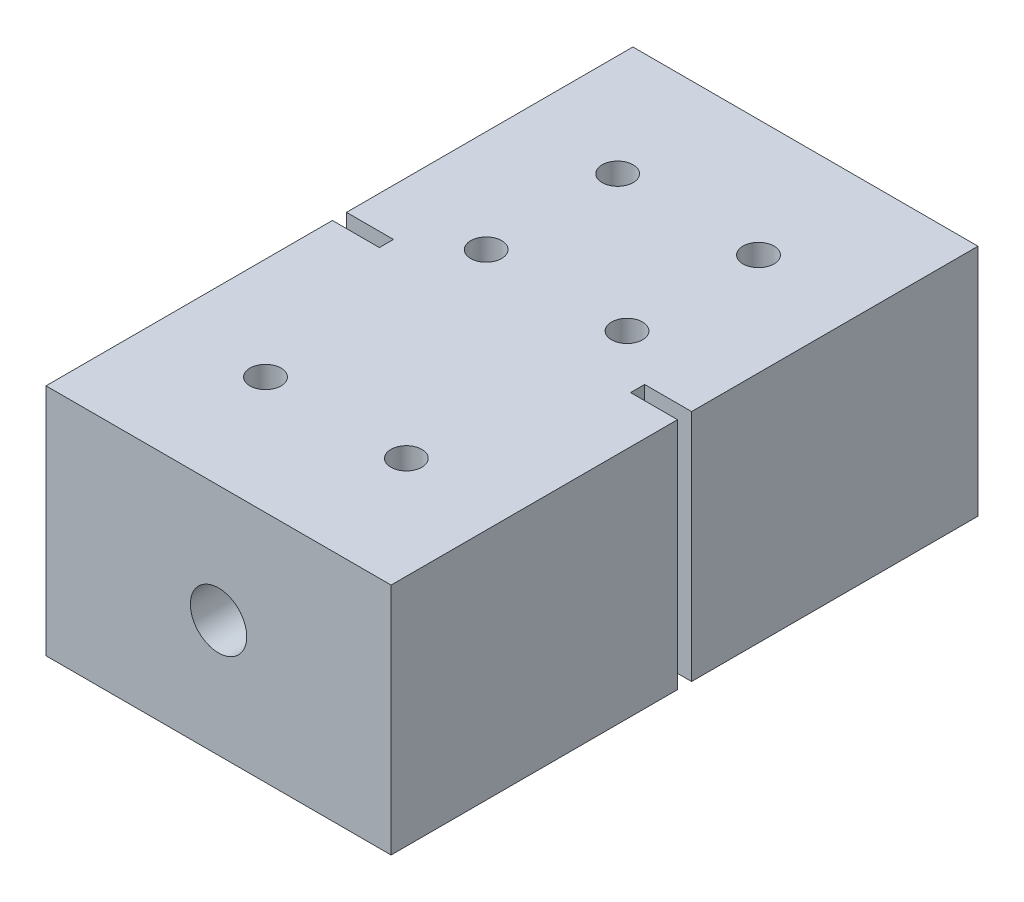
ISO-10303-21;
HEADER;
FILE_DESCRIPTION(('STEP AP214'),'2;1');
FILE_NAME('part.step','',(''),(''),'','','');
FILE_SCHEMA(('AUTOMOTIVE_DESIGN { 1 0 10303 214 1 1 1 1 }'));
ENDSEC;
DATA;
#1=APPLICATION_CONTEXT('core data for automotive mechanical design processes');
#2=APPLICATION_PROTOCOL_DEFINITION('international standard','automotive_design',2000,#1);
#3=PRODUCT_CONTEXT('',#1,'mechanical');
#4=PRODUCT('Part','Part','',(#3));
#5=PRODUCT_RELATED_PRODUCT_CATEGORY('part','',(#4));
#6=PRODUCT_DEFINITION_FORMATION('','',#4);
#7=PRODUCT_DEFINITION_CONTEXT('part definition',#1,'design');
#8=PRODUCT_DEFINITION('design','',#6,#7);
#9=PRODUCT_DEFINITION_SHAPE('','',#8);
#10=(LENGTH_UNIT() NAMED_UNIT(*) SI_UNIT(.MILLI.,.METRE.));
#11=(NAMED_UNIT(*) PLANE_ANGLE_UNIT() SI_UNIT($,.RADIAN.));
#12=(NAMED_UNIT(*) SI_UNIT($,.STERADIAN.) SOLID_ANGLE_UNIT());
#13=UNCERTAINTY_MEASURE_WITH_UNIT(LENGTH_MEASURE(1.E-05),#10,'distance_accuracy_value','');
#14=(GEOMETRIC_REPRESENTATION_CONTEXT(3) GLOBAL_UNCERTAINTY_ASSIGNED_CONTEXT((#13)) GLOBAL_UNIT_ASSIGNED_CONTEXT((#10,
#11,#12)) REPRESENTATION_CONTEXT('',''));
#15=CARTESIAN_POINT('',(0.,0.,0.));
#16=DIRECTION('',(0.,0.,1.));
#17=DIRECTION('',(1.,0.,0.));
#18=AXIS2_PLACEMENT_3D('',#15,#16,#17);
#19=CARTESIAN_POINT('',(0.,0.,125.));
#20=DIRECTION('',(1.,0.,0.));
#21=DIRECTION('',(0.,0.,-1.));
#22=AXIS2_PLACEMENT_3D('',#19,#20,#21);
#23=PLANE('',#22);
#24=DIRECTION('',(0.,-1.,0.));
#25=VECTOR('',#24,1.);
#26=CARTESIAN_POINT('',(0.,49.8,64.));
#27=LINE('',#26,#25);
#28=CARTESIAN_POINT('',(0.,49.8,64.));
#29=VERTEX_POINT('',#28);
#30=CARTESIAN_POINT('',(0.,0.,64.));
#31=VERTEX_POINT('',#30);
#32=EDGE_CURVE('E258',#29,#31,#27,.T.);
#33=ORIENTED_EDGE('',*,*,#32,.T.);
#34=DIRECTION('',(0.,0.,-1.));
#35=VECTOR('',#34,1.);
#36=CARTESIAN_POINT('',(0.,0.,125.));
#37=LINE('',#36,#35);
#38=CARTESIAN_POINT('',(0.,0.,125.));
#39=VERTEX_POINT('',#38);
#40=EDGE_CURVE('E11',#39,#31,#37,.T.);
#41=ORIENTED_EDGE('',*,*,#40,.F.);
#42=DIRECTION('',(0.,-1.,0.));
#43=VECTOR('',#42,1.);
#44=CARTESIAN_POINT('',(0.,0.,125.));
#45=LINE('',#44,#43);
#46=CARTESIAN_POINT('',(0.,49.8,125.));
#47=VERTEX_POINT('',#46);
#48=EDGE_CURVE('E181',#47,#39,#45,.T.);
#49=ORIENTED_EDGE('',*,*,#48,.F.);
#50=DIRECTION('',(0.,0.,-1.));
#51=VECTOR('',#50,1.);
#52=CARTESIAN_POINT('',(0.,49.8,125.));
#53=LINE('',#52,#51);
#54=EDGE_CURVE('E142',#47,#29,#53,.T.);
#55=ORIENTED_EDGE('',*,*,#54,.T.);
#56=EDGE_LOOP('',(#33,#41,#49,#55));
#57=FACE_BOUND('',#56,.T.);
#58=ADVANCED_FACE('F32',(#57),#23,.F.);
#59=DIRECTION('',(0.,-1.,0.));
#60=VECTOR('',#59,1.);
#61=CARTESIAN_POINT('',(0.,49.8,61.));
#62=LINE('',#61,#60);
#63=CARTESIAN_POINT('',(0.,49.8,61.));
#64=VERTEX_POINT('',#63);
#65=CARTESIAN_POINT('',(0.,0.,61.));
#66=VERTEX_POINT('',#65);
#67=EDGE_CURVE('E121',#64,#66,#62,.T.);
#68=ORIENTED_EDGE('',*,*,#67,.F.);
#69=CARTESIAN_POINT('',(0.,49.8,0.));
#70=VERTEX_POINT('',#69);
#71=EDGE_CURVE('E133',#64,#70,#53,.T.);
#72=ORIENTED_EDGE('',*,*,#71,.T.);
#73=DIRECTION('',(0.,-1.,0.));
#74=VECTOR('',#73,1.);
#75=CARTESIAN_POINT('',(0.,0.,0.));
#76=LINE('',#75,#74);
#77=CARTESIAN_POINT('',(0.,0.,0.));
#78=VERTEX_POINT('',#77);
#79=EDGE_CURVE('E178',#70,#78,#76,.T.);
#80=ORIENTED_EDGE('',*,*,#79,.T.);
#81=EDGE_CURVE('E39',#66,#78,#37,.T.);
#82=ORIENTED_EDGE('',*,*,#81,.F.);
#83=EDGE_LOOP('',(#68,#72,#80,#82));
#84=FACE_BOUND('',#83,.T.);
#85=ADVANCED_FACE('F131',(#84),#23,.F.);
#86=CARTESIAN_POINT('',(0.,0.,125.));
#87=DIRECTION('',(0.,1.,0.));
#88=DIRECTION('',(0.,0.,1.));
#89=AXIS2_PLACEMENT_3D('',#86,#87,#88);
#90=PLANE('',#89);
#91=CARTESIAN_POINT('',(51.75,0.,53.));
#92=DIRECTION('',(0.,1.,0.));
#93=DIRECTION('',(0.,0.,1.));
#94=AXIS2_PLACEMENT_3D('',#91,#92,#93);
#95=CIRCLE('',#94,3.29999999999999);
#96=CARTESIAN_POINT('',(51.75,0.,56.3));
#97=VERTEX_POINT('',#96);
#98=EDGE_CURVE('E218',#97,#97,#95,.T.);
#99=ORIENTED_EDGE('',*,*,#98,.T.);
#100=EDGE_LOOP('',(#99));
#101=FACE_BOUND('',#100,.T.);
#102=CARTESIAN_POINT('',(21.75,0.,53.));
#103=DIRECTION('',(0.,1.,0.));
#104=DIRECTION('',(0.,0.,1.));
#105=AXIS2_PLACEMENT_3D('',#102,#103,#104);
#106=CIRCLE('',#105,3.29999999999999);
#107=CARTESIAN_POINT('',(21.75,0.,56.3));
#108=VERTEX_POINT('',#107);
#109=EDGE_CURVE('E229',#108,#108,#106,.T.);
#110=ORIENTED_EDGE('',*,*,#109,.T.);
#111=EDGE_LOOP('',(#110));
#112=FACE_BOUND('',#111,.T.);
#113=CARTESIAN_POINT('',(21.75,0.,100.));
#114=DIRECTION('',(0.,1.,0.));
#115=DIRECTION('',(0.,0.,1.));
#116=AXIS2_PLACEMENT_3D('',#113,#114,#115);
#117=CIRCLE('',#116,3.29999999999999);
#118=CARTESIAN_POINT('',(21.75,0.,103.3));
#119=VERTEX_POINT('',#118);
#120=EDGE_CURVE('E235',#119,#119,#117,.T.);
#121=ORIENTED_EDGE('',*,*,#120,.T.);
#122=EDGE_LOOP('',(#121));
#123=FACE_BOUND('',#122,.T.);
#124=CARTESIAN_POINT('',(51.75,0.,25.));
#125=DIRECTION('',(0.,1.,0.));
#126=DIRECTION('',(0.,0.,1.));
#127=AXIS2_PLACEMENT_3D('',#124,#125,#126);
#128=CIRCLE('',#127,3.29999999999999);
#129=CARTESIAN_POINT('',(51.75,0.,28.3));
#130=VERTEX_POINT('',#129);
#131=EDGE_CURVE('E241',#130,#130,#128,.T.);
#132=ORIENTED_EDGE('',*,*,#131,.T.);
#133=EDGE_LOOP('',(#132));
#134=FACE_BOUND('',#133,.T.);
#135=CARTESIAN_POINT('',(21.75,0.,25.));
#136=DIRECTION('',(0.,1.,0.));
#137=DIRECTION('',(0.,0.,1.));
#138=AXIS2_PLACEMENT_3D('',#135,#136,#137);
#139=CIRCLE('',#138,3.29999999999999);
#140=CARTESIAN_POINT('',(21.75,0.,28.3));
#141=VERTEX_POINT('',#140);
#142=EDGE_CURVE('E247',#141,#141,#139,.T.);
#143=ORIENTED_EDGE('',*,*,#142,.T.);
#144=EDGE_LOOP('',(#143));
#145=FACE_BOUND('',#144,.T.);
#146=CARTESIAN_POINT('',(51.75,0.,100.));
#147=DIRECTION('',(0.,1.,0.));
#148=DIRECTION('',(0.,0.,1.));
#149=AXIS2_PLACEMENT_3D('',#146,#147,#148);
#150=CIRCLE('',#149,3.29999999999999);
#151=CARTESIAN_POINT('',(51.75,0.,103.3));
#152=VERTEX_POINT('',#151);
#153=EDGE_CURVE('E253',#152,#152,#150,.T.);
#154=ORIENTED_EDGE('',*,*,#153,.T.);
#155=EDGE_LOOP('',(#154));
#156=FACE_BOUND('',#155,.T.);
#157=DIRECTION('',(1.,0.,0.));
#158=VECTOR('',#157,1.);
#159=CARTESIAN_POINT('',(0.,0.,64.));
#160=LINE('',#159,#158);
#161=CARTESIAN_POINT('',(10.,0.,64.));
#162=VERTEX_POINT('',#161);
#163=EDGE_CURVE('E127',#31,#162,#160,.T.);
#164=ORIENTED_EDGE('',*,*,#163,.T.);
#165=DIRECTION('',(0.,0.,-1.));
#166=VECTOR('',#165,1.);
#167=CARTESIAN_POINT('',(10.,0.,64.));
#168=LINE('',#167,#166);
#169=CARTESIAN_POINT('',(10.,0.,61.));
#170=VERTEX_POINT('',#169);
#171=EDGE_CURVE('E266',#162,#170,#168,.T.);
#172=ORIENTED_EDGE('',*,*,#171,.T.);
#173=DIRECTION('',(-1.,0.,0.));
#174=VECTOR('',#173,1.);
#175=CARTESIAN_POINT('',(0.,0.,61.));
#176=LINE('',#175,#174);
#177=EDGE_CURVE('E269',#170,#66,#176,.T.);
#178=ORIENTED_EDGE('',*,*,#177,.T.);
#179=ORIENTED_EDGE('',*,*,#81,.T.);
#180=DIRECTION('',(1.,0.,0.));
#181=VECTOR('',#180,1.);
#182=CARTESIAN_POINT('',(0.,0.,0.));
#183=LINE('',#182,#181);
#184=CARTESIAN_POINT('',(73.5,0.,0.));
#185=VERTEX_POINT('',#184);
#186=EDGE_CURVE('E174',#78,#185,#183,.T.);
#187=ORIENTED_EDGE('',*,*,#186,.T.);
#188=DIRECTION('',(0.,0.,-1.));
#189=VECTOR('',#188,1.);
#190=CARTESIAN_POINT('',(73.5,0.,125.));
#191=LINE('',#190,#189);
#192=CARTESIAN_POINT('',(73.5,0.,61.));
#193=VERTEX_POINT('',#192);
#194=EDGE_CURVE('E154',#193,#185,#191,.T.);
#195=ORIENTED_EDGE('',*,*,#194,.F.);
#196=DIRECTION('',(1.,0.,0.));
#197=VECTOR('',#196,1.);
#198=CARTESIAN_POINT('',(73.5,0.,61.));
#199=LINE('',#198,#197);
#200=CARTESIAN_POINT('',(63.5,0.,61.));
#201=VERTEX_POINT('',#200);
#202=EDGE_CURVE('E209',#201,#193,#199,.T.);
#203=ORIENTED_EDGE('',*,*,#202,.F.);
#204=DIRECTION('',(0.,0.,-1.));
#205=VECTOR('',#204,1.);
#206=CARTESIAN_POINT('',(63.5,0.,64.));
#207=LINE('',#206,#205);
#208=CARTESIAN_POINT('',(63.5,0.,64.));
#209=VERTEX_POINT('',#208);
#210=EDGE_CURVE('E212',#209,#201,#207,.T.);
#211=ORIENTED_EDGE('',*,*,#210,.F.);
#212=DIRECTION('',(-1.,0.,0.));
#213=VECTOR('',#212,1.);
#214=CARTESIAN_POINT('',(73.5,0.,64.));
#215=LINE('',#214,#213);
#216=CARTESIAN_POINT('',(73.5,0.,64.));
#217=VERTEX_POINT('',#216);
#218=EDGE_CURVE('E215',#217,#209,#215,.T.);
#219=ORIENTED_EDGE('',*,*,#218,.F.);
#220=CARTESIAN_POINT('',(73.5,0.,125.));
#221=VERTEX_POINT('',#220);
#222=EDGE_CURVE('E155',#221,#217,#191,.T.);
#223=ORIENTED_EDGE('',*,*,#222,.F.);
#224=DIRECTION('',(1.,0.,0.));
#225=VECTOR('',#224,1.);
#226=CARTESIAN_POINT('',(0.,0.,125.));
#227=LINE('',#226,#225);
#228=EDGE_CURVE('E186',#39,#221,#227,.T.);
#229=ORIENTED_EDGE('',*,*,#228,.F.);
#230=ORIENTED_EDGE('',*,*,#40,.T.);
#231=EDGE_LOOP('',(#164,#172,#178,#179,#187,#195,#203,#211,#219,#223,#229,#230));
#232=FACE_BOUND('',#231,.T.);
#233=ADVANCED_FACE('F176',(#101,#112,#123,#134,#145,#156,#232),#90,.F.);
#234=CARTESIAN_POINT('',(0.,49.8,125.));
#235=DIRECTION('',(0.,-1.,0.));
#236=DIRECTION('',(0.,0.,-1.));
#237=AXIS2_PLACEMENT_3D('',#234,#235,#236);
#238=PLANE('',#237);
#239=CARTESIAN_POINT('',(51.75,49.8,53.));
#240=DIRECTION('',(0.,1.,0.));
#241=DIRECTION('',(0.,0.,1.));
#242=AXIS2_PLACEMENT_3D('',#239,#240,#241);
#243=CIRCLE('',#242,3.3);
#244=CARTESIAN_POINT('',(51.75,49.8,56.3));
#245=VERTEX_POINT('',#244);
#246=EDGE_CURVE('E226',#245,#245,#243,.T.);
#247=ORIENTED_EDGE('',*,*,#246,.F.);
#248=EDGE_LOOP('',(#247));
#249=FACE_BOUND('',#248,.T.);
#250=CARTESIAN_POINT('',(21.75,49.8,53.));
#251=DIRECTION('',(0.,1.,0.));
#252=DIRECTION('',(0.,0.,1.));
#253=AXIS2_PLACEMENT_3D('',#250,#251,#252);
#254=CIRCLE('',#253,3.29999999999999);
#255=CARTESIAN_POINT('',(21.75,49.8,56.3));
#256=VERTEX_POINT('',#255);
#257=EDGE_CURVE('E232',#256,#256,#254,.T.);
#258=ORIENTED_EDGE('',*,*,#257,.F.);
#259=EDGE_LOOP('',(#258));
#260=FACE_BOUND('',#259,.T.);
#261=CARTESIAN_POINT('',(21.75,49.8,100.));
#262=DIRECTION('',(0.,1.,0.));
#263=DIRECTION('',(0.,0.,1.));
#264=AXIS2_PLACEMENT_3D('',#261,#262,#263);
#265=CIRCLE('',#264,3.29999999999999);
#266=CARTESIAN_POINT('',(21.75,49.8,103.3));
#267=VERTEX_POINT('',#266);
#268=EDGE_CURVE('E238',#267,#267,#265,.T.);
#269=ORIENTED_EDGE('',*,*,#268,.F.);
#270=EDGE_LOOP('',(#269));
#271=FACE_BOUND('',#270,.T.);
#272=CARTESIAN_POINT('',(51.75,49.8,25.));
#273=DIRECTION('',(0.,1.,0.));
#274=DIRECTION('',(0.,0.,1.));
#275=AXIS2_PLACEMENT_3D('',#272,#273,#274);
#276=CIRCLE('',#275,3.3);
#277=CARTESIAN_POINT('',(51.75,49.8,28.3));
#278=VERTEX_POINT('',#277);
#279=EDGE_CURVE('E244',#278,#278,#276,.T.);
#280=ORIENTED_EDGE('',*,*,#279,.F.);
#281=EDGE_LOOP('',(#280));
#282=FACE_BOUND('',#281,.T.);
#283=CARTESIAN_POINT('',(21.75,49.8,25.));
#284=DIRECTION('',(0.,1.,0.));
#285=DIRECTION('',(0.,0.,1.));
#286=AXIS2_PLACEMENT_3D('',#283,#284,#285);
#287=CIRCLE('',#286,3.29999999999999);
#288=CARTESIAN_POINT('',(21.75,49.8,28.3));
#289=VERTEX_POINT('',#288);
#290=EDGE_CURVE('E250',#289,#289,#287,.T.);
#291=ORIENTED_EDGE('',*,*,#290,.F.);
#292=EDGE_LOOP('',(#291));
#293=FACE_BOUND('',#292,.T.);
#294=CARTESIAN_POINT('',(51.75,49.8,100.));
#295=DIRECTION('',(0.,1.,0.));
#296=DIRECTION('',(0.,0.,1.));
#297=AXIS2_PLACEMENT_3D('',#294,#295,#296);
#298=CIRCLE('',#297,3.3);
#299=CARTESIAN_POINT('',(51.75,49.8,103.3));
#300=VERTEX_POINT('',#299);
#301=EDGE_CURVE('E256',#300,#300,#298,.T.);
#302=ORIENTED_EDGE('',*,*,#301,.F.);
#303=EDGE_LOOP('',(#302));
#304=FACE_BOUND('',#303,.T.);
#305=DIRECTION('',(1.,0.,0.));
#306=VECTOR('',#305,1.);
#307=CARTESIAN_POINT('',(0.,49.8,64.));
#308=LINE('',#307,#306);
#309=CARTESIAN_POINT('',(10.,49.8,64.));
#310=VERTEX_POINT('',#309);
#311=EDGE_CURVE('E135',#29,#310,#308,.T.);
#312=ORIENTED_EDGE('',*,*,#311,.F.);
#313=ORIENTED_EDGE('',*,*,#54,.F.);
#314=DIRECTION('',(-1.,0.,0.));
#315=VECTOR('',#314,1.);
#316=CARTESIAN_POINT('',(0.,49.8,125.));
#317=LINE('',#316,#315);
#318=CARTESIAN_POINT('',(73.5,49.8,125.));
#319=VERTEX_POINT('',#318);
#320=EDGE_CURVE('E143',#319,#47,#317,.T.);
#321=ORIENTED_EDGE('',*,*,#320,.F.);
#322=DIRECTION('',(0.,0.,-1.));
#323=VECTOR('',#322,1.);
#324=CARTESIAN_POINT('',(73.5,49.8,125.));
#325=LINE('',#324,#323);
#326=CARTESIAN_POINT('',(73.5,49.8,64.));
#327=VERTEX_POINT('',#326);
#328=EDGE_CURVE('E152',#319,#327,#325,.T.);
#329=ORIENTED_EDGE('',*,*,#328,.T.);
#330=DIRECTION('',(-1.,0.,0.));
#331=VECTOR('',#330,1.);
#332=CARTESIAN_POINT('',(73.5,49.8,64.));
#333=LINE('',#332,#331);
#334=CARTESIAN_POINT('',(63.5,49.8,64.));
#335=VERTEX_POINT('',#334);
#336=EDGE_CURVE('E211',#327,#335,#333,.T.);
#337=ORIENTED_EDGE('',*,*,#336,.T.);
#338=DIRECTION('',(0.,0.,-1.));
#339=VECTOR('',#338,1.);
#340=CARTESIAN_POINT('',(63.5,49.8,64.));
#341=LINE('',#340,#339);
#342=CARTESIAN_POINT('',(63.5,49.8,61.));
#343=VERTEX_POINT('',#342);
#344=EDGE_CURVE('E54',#335,#343,#341,.T.);
#345=ORIENTED_EDGE('',*,*,#344,.T.);
#346=DIRECTION('',(1.,0.,0.));
#347=VECTOR('',#346,1.);
#348=CARTESIAN_POINT('',(73.5,49.8,61.));
#349=LINE('',#348,#347);
#350=CARTESIAN_POINT('',(73.5,49.8,61.));
#351=VERTEX_POINT('',#350);
#352=EDGE_CURVE('E204',#343,#351,#349,.T.);
#353=ORIENTED_EDGE('',*,*,#352,.T.);
#354=CARTESIAN_POINT('',(73.5,49.8,0.));
#355=VERTEX_POINT('',#354);
#356=EDGE_CURVE('E146',#351,#355,#325,.T.);
#357=ORIENTED_EDGE('',*,*,#356,.T.);
#358=DIRECTION('',(-1.,0.,0.));
#359=VECTOR('',#358,1.);
#360=CARTESIAN_POINT('',(0.,49.8,0.));
#361=LINE('',#360,#359);
#362=EDGE_CURVE('E140',#355,#70,#361,.T.);
#363=ORIENTED_EDGE('',*,*,#362,.T.);
#364=ORIENTED_EDGE('',*,*,#71,.F.);
#365=DIRECTION('',(-1.,0.,0.));
#366=VECTOR('',#365,1.);
#367=CARTESIAN_POINT('',(0.,49.8,61.));
#368=LINE('',#367,#366);
#369=CARTESIAN_POINT('',(10.,49.8,61.));
#370=VERTEX_POINT('',#369);
#371=EDGE_CURVE('E118',#370,#64,#368,.T.);
#372=ORIENTED_EDGE('',*,*,#371,.F.);
#373=DIRECTION('',(0.,0.,-1.));
#374=VECTOR('',#373,1.);
#375=CARTESIAN_POINT('',(10.,49.8,64.));
#376=LINE('',#375,#374);
#377=EDGE_CURVE('E126',#310,#370,#376,.T.);
#378=ORIENTED_EDGE('',*,*,#377,.F.);
#379=EDGE_LOOP('',(#312,#313,#321,#329,#337,#345,#353,#357,#363,#364,#372,#378));
#380=FACE_BOUND('',#379,.T.);
#381=ADVANCED_FACE('F138',(#249,#260,#271,#282,#293,#304,#380),#238,.F.);
#382=CARTESIAN_POINT('',(73.5,0.,125.));
#383=DIRECTION('',(-1.,0.,0.));
#384=DIRECTION('',(0.,-1.,0.));
#385=AXIS2_PLACEMENT_3D('',#382,#383,#384);
#386=PLANE('',#385);
#387=ORIENTED_EDGE('',*,*,#356,.F.);
#388=DIRECTION('',(0.,-1.,0.));
#389=VECTOR('',#388,1.);
#390=CARTESIAN_POINT('',(73.5,49.8,61.));
#391=LINE('',#390,#389);
#392=EDGE_CURVE('E170',#351,#193,#391,.T.);
#393=ORIENTED_EDGE('',*,*,#392,.T.);
#394=ORIENTED_EDGE('',*,*,#194,.T.);
#395=DIRECTION('',(0.,1.,0.));
#396=VECTOR('',#395,1.);
#397=CARTESIAN_POINT('',(73.5,0.,0.));
#398=LINE('',#397,#396);
#399=EDGE_CURVE('E169',#185,#355,#398,.T.);
#400=ORIENTED_EDGE('',*,*,#399,.T.);
#401=EDGE_LOOP('',(#387,#393,#394,#400));
#402=FACE_BOUND('',#401,.T.);
#403=ADVANCED_FACE('F167',(#402),#386,.F.);
#404=ORIENTED_EDGE('',*,*,#222,.T.);
#405=DIRECTION('',(0.,-1.,0.));
#406=VECTOR('',#405,1.);
#407=CARTESIAN_POINT('',(73.5,49.8,64.));
#408=LINE('',#407,#406);
#409=EDGE_CURVE('E201',#327,#217,#408,.T.);
#410=ORIENTED_EDGE('',*,*,#409,.F.);
#411=ORIENTED_EDGE('',*,*,#328,.F.);
#412=DIRECTION('',(0.,1.,0.));
#413=VECTOR('',#412,1.);
#414=CARTESIAN_POINT('',(73.5,0.,125.));
#415=LINE('',#414,#413);
#416=EDGE_CURVE('E147',#221,#319,#415,.T.);
#417=ORIENTED_EDGE('',*,*,#416,.F.);
#418=EDGE_LOOP('',(#404,#410,#411,#417));
#419=FACE_BOUND('',#418,.T.);
#420=ADVANCED_FACE('F285',(#419),#386,.F.);
#421=CARTESIAN_POINT('',(0.,0.,125.));
#422=DIRECTION('',(0.,0.,-1.));
#423=DIRECTION('',(-1.,0.,0.));
#424=AXIS2_PLACEMENT_3D('',#421,#422,#423);
#425=PLANE('',#424);
#426=CARTESIAN_POINT('',(36.75,24.9,125.));
#427=DIRECTION('',(0.,0.,-1.));
#428=DIRECTION('',(-1.,0.,0.));
#429=AXIS2_PLACEMENT_3D('',#426,#427,#428);
#430=CIRCLE('',#429,5.99999999999999);
#431=CARTESIAN_POINT('',(30.75,24.9,125.));
#432=VERTEX_POINT('',#431);
#433=EDGE_CURVE('E193',#432,#432,#430,.T.);
#434=ORIENTED_EDGE('',*,*,#433,.T.);
#435=EDGE_LOOP('',(#434));
#436=FACE_BOUND('',#435,.T.);
#437=ORIENTED_EDGE('',*,*,#48,.T.);
#438=ORIENTED_EDGE('',*,*,#228,.T.);
#439=ORIENTED_EDGE('',*,*,#416,.T.);
#440=ORIENTED_EDGE('',*,*,#320,.T.);
#441=EDGE_LOOP('',(#437,#438,#439,#440));
#442=FACE_BOUND('',#441,.T.);
#443=ADVANCED_FACE('F283',(#436,#442),#425,.F.);
#444=CARTESIAN_POINT('',(0.,0.,0.));
#445=DIRECTION('',(0.,0.,-1.));
#446=DIRECTION('',(-1.,0.,0.));
#447=AXIS2_PLACEMENT_3D('',#444,#445,#446);
#448=PLANE('',#447);
#449=CARTESIAN_POINT('',(36.75,24.9,0.));
#450=DIRECTION('',(0.,0.,-1.));
#451=DIRECTION('',(-1.,0.,0.));
#452=AXIS2_PLACEMENT_3D('',#449,#450,#451);
#453=CIRCLE('',#452,10.95);
#454=CARTESIAN_POINT('',(25.8,24.9,0.));
#455=VERTEX_POINT('',#454);
#456=EDGE_CURVE('E190',#455,#455,#453,.T.);
#457=ORIENTED_EDGE('',*,*,#456,.F.);
#458=EDGE_LOOP('',(#457));
#459=FACE_BOUND('',#458,.T.);
#460=ORIENTED_EDGE('',*,*,#79,.F.);
#461=ORIENTED_EDGE('',*,*,#362,.F.);
#462=ORIENTED_EDGE('',*,*,#399,.F.);
#463=ORIENTED_EDGE('',*,*,#186,.F.);
#464=EDGE_LOOP('',(#460,#461,#462,#463));
#465=FACE_BOUND('',#464,.T.);
#466=ADVANCED_FACE('F180',(#459,#465),#448,.T.);
#467=CARTESIAN_POINT('',(36.75,24.9,15.));
#468=DIRECTION('',(0.,0.,-1.));
#469=DIRECTION('',(-1.,0.,0.));
#470=AXIS2_PLACEMENT_3D('',#467,#468,#469);
#471=CYLINDRICAL_SURFACE('',#470,10.95);
#472=CARTESIAN_POINT('',(36.75,24.9,15.));
#473=DIRECTION('',(0.,0.,-1.));
#474=DIRECTION('',(-1.,0.,0.));
#475=AXIS2_PLACEMENT_3D('',#472,#473,#474);
#476=CIRCLE('',#475,10.95);
#477=CARTESIAN_POINT('',(25.8,24.9,15.));
#478=VERTEX_POINT('',#477);
#479=EDGE_CURVE('E183',#478,#478,#476,.T.);
#480=ORIENTED_EDGE('',*,*,#479,.F.);
#481=EDGE_LOOP('',(#480));
#482=FACE_BOUND('',#481,.T.);
#483=ORIENTED_EDGE('',*,*,#456,.T.);
#484=EDGE_LOOP('',(#483));
#485=FACE_BOUND('',#484,.T.);
#486=ADVANCED_FACE('F325',(#482,#485),#471,.F.);
#487=CARTESIAN_POINT('',(36.75,24.9,15.));
#488=DIRECTION('',(0.,0.,-1.));
#489=DIRECTION('',(-1.,0.,0.));
#490=AXIS2_PLACEMENT_3D('',#487,#488,#489);
#491=PLANE('',#490);
#492=CARTESIAN_POINT('',(36.75,24.9,15.));
#493=DIRECTION('',(0.,0.,-1.));
#494=DIRECTION('',(-1.,0.,0.));
#495=AXIS2_PLACEMENT_3D('',#492,#493,#494);
#496=CIRCLE('',#495,5.99999999999999);
#497=CARTESIAN_POINT('',(30.75,24.9,15.));
#498=VERTEX_POINT('',#497);
#499=EDGE_CURVE('E196',#498,#498,#496,.T.);
#500=ORIENTED_EDGE('',*,*,#499,.F.);
#501=EDGE_LOOP('',(#500));
#502=FACE_BOUND('',#501,.T.);
#503=ORIENTED_EDGE('',*,*,#479,.T.);
#504=EDGE_LOOP('',(#503));
#505=FACE_BOUND('',#504,.T.);
#506=ADVANCED_FACE('F302',(#502,#505),#491,.T.);
#507=CARTESIAN_POINT('',(36.75,24.9,125.));
#508=DIRECTION('',(0.,0.,-1.));
#509=DIRECTION('',(-1.,0.,0.));
#510=AXIS2_PLACEMENT_3D('',#507,#508,#509);
#511=CYLINDRICAL_SURFACE('',#510,5.99999999999999);
#512=ORIENTED_EDGE('',*,*,#433,.F.);
#513=EDGE_LOOP('',(#512));
#514=FACE_BOUND('',#513,.T.);
#515=ORIENTED_EDGE('',*,*,#499,.T.);
#516=EDGE_LOOP('',(#515));
#517=FACE_BOUND('',#516,.T.);
#518=ADVANCED_FACE('F295',(#514,#517),#511,.F.);
#519=CARTESIAN_POINT('',(73.5,49.8,61.));
#520=DIRECTION('',(0.,0.,-1.));
#521=DIRECTION('',(-1.,0.,0.));
#522=AXIS2_PLACEMENT_3D('',#519,#520,#521);
#523=PLANE('',#522);
#524=ORIENTED_EDGE('',*,*,#202,.T.);
#525=ORIENTED_EDGE('',*,*,#392,.F.);
#526=ORIENTED_EDGE('',*,*,#352,.F.);
#527=DIRECTION('',(0.,-1.,0.));
#528=VECTOR('',#527,1.);
#529=CARTESIAN_POINT('',(63.5,49.8,61.));
#530=LINE('',#529,#528);
#531=EDGE_CURVE('E206',#343,#201,#530,.T.);
#532=ORIENTED_EDGE('',*,*,#531,.T.);
#533=EDGE_LOOP('',(#524,#525,#526,#532));
#534=FACE_BOUND('',#533,.T.);
#535=ADVANCED_FACE('F293',(#534),#523,.F.);
#536=CARTESIAN_POINT('',(63.5,49.8,64.));
#537=DIRECTION('',(-1.,0.,0.));
#538=DIRECTION('',(0.,0.,1.));
#539=AXIS2_PLACEMENT_3D('',#536,#537,#538);
#540=PLANE('',#539);
#541=ORIENTED_EDGE('',*,*,#210,.T.);
#542=ORIENTED_EDGE('',*,*,#531,.F.);
#543=ORIENTED_EDGE('',*,*,#344,.F.);
#544=DIRECTION('',(0.,-1.,0.));
#545=VECTOR('',#544,1.);
#546=CARTESIAN_POINT('',(63.5,49.8,64.));
#547=LINE('',#546,#545);
#548=EDGE_CURVE('E203',#335,#209,#547,.T.);
#549=ORIENTED_EDGE('',*,*,#548,.T.);
#550=EDGE_LOOP('',(#541,#542,#543,#549));
#551=FACE_BOUND('',#550,.T.);
#552=ADVANCED_FACE('F290',(#551),#540,.F.);
#553=CARTESIAN_POINT('',(73.5,49.8,64.));
#554=DIRECTION('',(0.,0.,1.));
#555=DIRECTION('',(1.,0.,0.));
#556=AXIS2_PLACEMENT_3D('',#553,#554,#555);
#557=PLANE('',#556);
#558=ORIENTED_EDGE('',*,*,#218,.T.);
#559=ORIENTED_EDGE('',*,*,#548,.F.);
#560=ORIENTED_EDGE('',*,*,#336,.F.);
#561=ORIENTED_EDGE('',*,*,#409,.T.);
#562=EDGE_LOOP('',(#558,#559,#560,#561));
#563=FACE_BOUND('',#562,.T.);
#564=ADVANCED_FACE('F288',(#563),#557,.F.);
#565=CARTESIAN_POINT('',(51.75,49.8,53.));
#566=DIRECTION('',(0.,1.,0.));
#567=DIRECTION('',(0.,0.,1.));
#568=AXIS2_PLACEMENT_3D('',#565,#566,#567);
#569=CYLINDRICAL_SURFACE('',#568,3.29999999999999);
#570=ORIENTED_EDGE('',*,*,#98,.F.);
#571=EDGE_LOOP('',(#570));
#572=FACE_BOUND('',#571,.T.);
#573=ORIENTED_EDGE('',*,*,#246,.T.);
#574=EDGE_LOOP('',(#573));
#575=FACE_BOUND('',#574,.T.);
#576=ADVANCED_FACE('F337',(#572,#575),#569,.F.);
#577=CARTESIAN_POINT('',(21.75,49.8,53.));
#578=DIRECTION('',(0.,1.,0.));
#579=DIRECTION('',(0.,0.,1.));
#580=AXIS2_PLACEMENT_3D('',#577,#578,#579);
#581=CYLINDRICAL_SURFACE('',#580,3.29999999999999);
#582=ORIENTED_EDGE('',*,*,#109,.F.);
#583=EDGE_LOOP('',(#582));
#584=FACE_BOUND('',#583,.T.);
#585=ORIENTED_EDGE('',*,*,#257,.T.);
#586=EDGE_LOOP('',(#585));
#587=FACE_BOUND('',#586,.T.);
#588=ADVANCED_FACE('F341',(#584,#587),#581,.F.);
#589=CARTESIAN_POINT('',(21.75,49.8,100.));
#590=DIRECTION('',(0.,1.,0.));
#591=DIRECTION('',(0.,0.,1.));
#592=AXIS2_PLACEMENT_3D('',#589,#590,#591);
#593=CYLINDRICAL_SURFACE('',#592,3.29999999999999);
#594=ORIENTED_EDGE('',*,*,#120,.F.);
#595=EDGE_LOOP('',(#594));
#596=FACE_BOUND('',#595,.T.);
#597=ORIENTED_EDGE('',*,*,#268,.T.);
#598=EDGE_LOOP('',(#597));
#599=FACE_BOUND('',#598,.T.);
#600=ADVANCED_FACE('F346',(#596,#599),#593,.F.);
#601=CARTESIAN_POINT('',(51.75,49.8,25.));
#602=DIRECTION('',(0.,1.,0.));
#603=DIRECTION('',(0.,0.,1.));
#604=AXIS2_PLACEMENT_3D('',#601,#602,#603);
#605=CYLINDRICAL_SURFACE('',#604,3.29999999999999);
#606=ORIENTED_EDGE('',*,*,#131,.F.);
#607=EDGE_LOOP('',(#606));
#608=FACE_BOUND('',#607,.T.);
#609=ORIENTED_EDGE('',*,*,#279,.T.);
#610=EDGE_LOOP('',(#609));
#611=FACE_BOUND('',#610,.T.);
#612=ADVANCED_FACE('F354',(#608,#611),#605,.F.);
#613=CARTESIAN_POINT('',(21.75,49.8,25.));
#614=DIRECTION('',(0.,1.,0.));
#615=DIRECTION('',(0.,0.,1.));
#616=AXIS2_PLACEMENT_3D('',#613,#614,#615);
#617=CYLINDRICAL_SURFACE('',#616,3.29999999999999);
#618=ORIENTED_EDGE('',*,*,#142,.F.);
#619=EDGE_LOOP('',(#618));
#620=FACE_BOUND('',#619,.T.);
#621=ORIENTED_EDGE('',*,*,#290,.T.);
#622=EDGE_LOOP('',(#621));
#623=FACE_BOUND('',#622,.T.);
#624=ADVANCED_FACE('F358',(#620,#623),#617,.F.);
#625=CARTESIAN_POINT('',(51.75,49.8,100.));
#626=DIRECTION('',(0.,1.,0.));
#627=DIRECTION('',(0.,0.,1.));
#628=AXIS2_PLACEMENT_3D('',#625,#626,#627);
#629=CYLINDRICAL_SURFACE('',#628,3.29999999999999);
#630=ORIENTED_EDGE('',*,*,#153,.F.);
#631=EDGE_LOOP('',(#630));
#632=FACE_BOUND('',#631,.T.);
#633=ORIENTED_EDGE('',*,*,#301,.T.);
#634=EDGE_LOOP('',(#633));
#635=FACE_BOUND('',#634,.T.);
#636=ADVANCED_FACE('F362',(#632,#635),#629,.F.);
#637=CARTESIAN_POINT('',(0.,49.8,64.));
#638=DIRECTION('',(0.,0.,-1.));
#639=DIRECTION('',(-1.,0.,0.));
#640=AXIS2_PLACEMENT_3D('',#637,#638,#639);
#641=PLANE('',#640);
#642=ORIENTED_EDGE('',*,*,#163,.F.);
#643=ORIENTED_EDGE('',*,*,#32,.F.);
#644=ORIENTED_EDGE('',*,*,#311,.T.);
#645=DIRECTION('',(0.,-1.,0.));
#646=VECTOR('',#645,1.);
#647=CARTESIAN_POINT('',(10.,49.8,64.));
#648=LINE('',#647,#646);
#649=EDGE_CURVE('E261',#310,#162,#648,.T.);
#650=ORIENTED_EDGE('',*,*,#649,.T.);
#651=EDGE_LOOP('',(#642,#643,#644,#650));
#652=FACE_BOUND('',#651,.T.);
#653=ADVANCED_FACE('F366',(#652),#641,.T.);
#654=CARTESIAN_POINT('',(10.,49.8,64.));
#655=DIRECTION('',(-1.,0.,0.));
#656=DIRECTION('',(0.,0.,1.));
#657=AXIS2_PLACEMENT_3D('',#654,#655,#656);
#658=PLANE('',#657);
#659=ORIENTED_EDGE('',*,*,#171,.F.);
#660=ORIENTED_EDGE('',*,*,#649,.F.);
#661=ORIENTED_EDGE('',*,*,#377,.T.);
#662=DIRECTION('',(0.,-1.,0.));
#663=VECTOR('',#662,1.);
#664=CARTESIAN_POINT('',(10.,49.8,61.));
#665=LINE('',#664,#663);
#666=EDGE_CURVE('E46',#370,#170,#665,.T.);
#667=ORIENTED_EDGE('',*,*,#666,.T.);
#668=EDGE_LOOP('',(#659,#660,#661,#667));
#669=FACE_BOUND('',#668,.T.);
#670=ADVANCED_FACE('F275',(#669),#658,.T.);
#671=CARTESIAN_POINT('',(0.,49.8,61.));
#672=DIRECTION('',(0.,0.,1.));
#673=DIRECTION('',(1.,0.,0.));
#674=AXIS2_PLACEMENT_3D('',#671,#672,#673);
#675=PLANE('',#674);
#676=ORIENTED_EDGE('',*,*,#177,.F.);
#677=ORIENTED_EDGE('',*,*,#666,.F.);
#678=ORIENTED_EDGE('',*,*,#371,.T.);
#679=ORIENTED_EDGE('',*,*,#67,.T.);
#680=EDGE_LOOP('',(#676,#677,#678,#679));
#681=FACE_BOUND('',#680,.T.);
#682=ADVANCED_FACE('F120',(#681),#675,.T.);
#683=CLOSED_SHELL('',(#58,#85,#233,#381,#403,#420,#443,#466,#486,#506,#518,#535,#552,#564,#576,
#588,#600,#612,#624,#636,#653,#670,#682));
#684=MANIFOLD_SOLID_BREP('B2',#683);
#685=ADVANCED_BREP_SHAPE_REPRESENTATION('',(#18,#684),#14);
#686=SHAPE_DEFINITION_REPRESENTATION(#9,#685);
ENDSEC;
END-ISO-10303-21;
